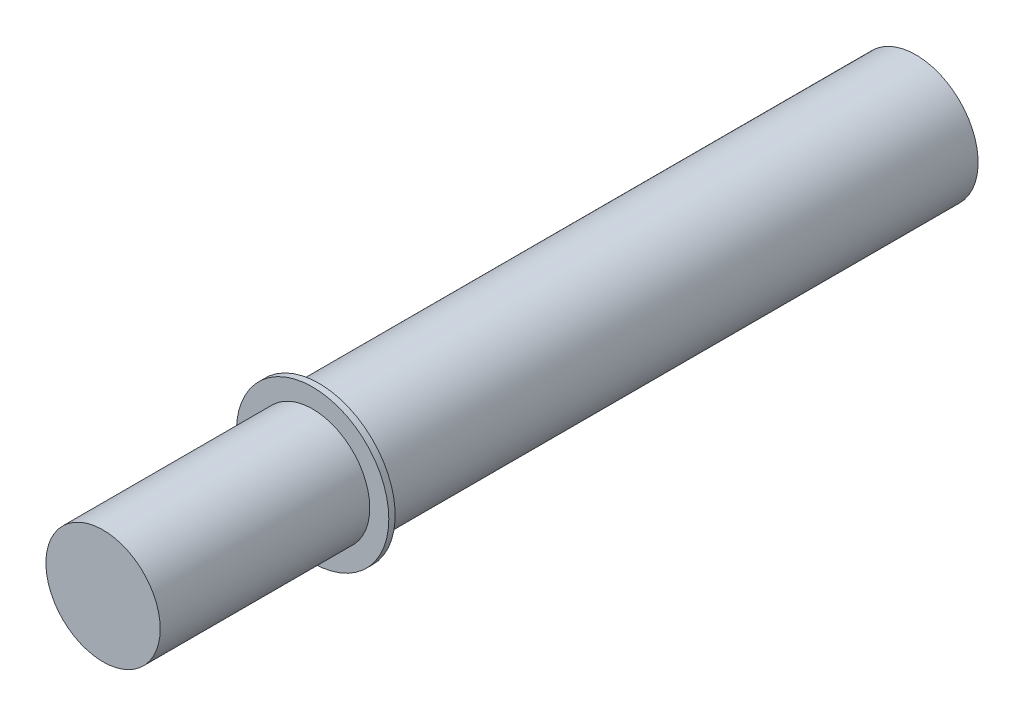
ISO-10303-21;
HEADER;
FILE_DESCRIPTION(('STEP AP214'),'2;1');
FILE_NAME('part.step','',(''),(''),'','','');
FILE_SCHEMA(('AUTOMOTIVE_DESIGN { 1 0 10303 214 1 1 1 1 }'));
ENDSEC;
DATA;
#1=APPLICATION_CONTEXT('core data for automotive mechanical design processes');
#2=APPLICATION_PROTOCOL_DEFINITION('international standard','automotive_design',2000,#1);
#3=PRODUCT_CONTEXT('',#1,'mechanical');
#4=PRODUCT('Part','Part','',(#3));
#5=PRODUCT_RELATED_PRODUCT_CATEGORY('part','',(#4));
#6=PRODUCT_DEFINITION_FORMATION('','',#4);
#7=PRODUCT_DEFINITION_CONTEXT('part definition',#1,'design');
#8=PRODUCT_DEFINITION('design','',#6,#7);
#9=PRODUCT_DEFINITION_SHAPE('','',#8);
#10=(LENGTH_UNIT() NAMED_UNIT(*) SI_UNIT(.MILLI.,.METRE.));
#11=(NAMED_UNIT(*) PLANE_ANGLE_UNIT() SI_UNIT($,.RADIAN.));
#12=(NAMED_UNIT(*) SI_UNIT($,.STERADIAN.) SOLID_ANGLE_UNIT());
#13=UNCERTAINTY_MEASURE_WITH_UNIT(LENGTH_MEASURE(1.E-05),#10,'distance_accuracy_value','');
#14=(GEOMETRIC_REPRESENTATION_CONTEXT(3) GLOBAL_UNCERTAINTY_ASSIGNED_CONTEXT((#13)) GLOBAL_UNIT_ASSIGNED_CONTEXT((#10,
#11,#12)) REPRESENTATION_CONTEXT('',''));
#15=CARTESIAN_POINT('',(0.,0.,0.));
#16=DIRECTION('',(0.,0.,1.));
#17=DIRECTION('',(1.,0.,0.));
#18=AXIS2_PLACEMENT_3D('',#15,#16,#17);
#19=CARTESIAN_POINT('',(0.,0.,64.));
#20=DIRECTION('',(0.,0.,-1.));
#21=DIRECTION('',(-1.,0.,0.));
#22=AXIS2_PLACEMENT_3D('',#19,#20,#21);
#23=CYLINDRICAL_SURFACE('',#22,6.);
#24=CARTESIAN_POINT('',(0.,0.,47.));
#25=DIRECTION('',(0.,0.,-1.));
#26=DIRECTION('',(-1.,0.,0.));
#27=AXIS2_PLACEMENT_3D('',#24,#25,#26);
#28=CIRCLE('',#27,6.);
#29=CARTESIAN_POINT('',(-6.,0.,47.));
#30=VERTEX_POINT('',#29);
#31=EDGE_CURVE('E11',#30,#30,#28,.T.);
#32=ORIENTED_EDGE('',*,*,#31,.F.);
#33=EDGE_LOOP('',(#32));
#34=FACE_BOUND('',#33,.T.);
#35=CARTESIAN_POINT('',(0.,0.,47.5));
#36=DIRECTION('',(0.,0.,1.));
#37=DIRECTION('',(1.,0.,0.));
#38=AXIS2_PLACEMENT_3D('',#35,#36,#37);
#39=CIRCLE('',#38,6.);
#40=CARTESIAN_POINT('',(6.,0.,47.5));
#41=VERTEX_POINT('',#40);
#42=EDGE_CURVE('E38',#41,#41,#39,.T.);
#43=ORIENTED_EDGE('',*,*,#42,.F.);
#44=EDGE_LOOP('',(#43));
#45=FACE_BOUND('',#44,.T.);
#46=ADVANCED_FACE('F35',(#34,#45),#23,.T.);
#47=CARTESIAN_POINT('',(0.,0.,47.));
#48=DIRECTION('',(0.,0.,-1.));
#49=DIRECTION('',(-1.,0.,0.));
#50=AXIS2_PLACEMENT_3D('',#47,#48,#49);
#51=PLANE('',#50);
#52=CARTESIAN_POINT('',(0.,0.,47.));
#53=DIRECTION('',(0.,0.,-1.));
#54=DIRECTION('',(-1.,0.,0.));
#55=AXIS2_PLACEMENT_3D('',#52,#53,#54);
#56=CIRCLE('',#55,4.9);
#57=CARTESIAN_POINT('',(-4.9,0.,47.));
#58=VERTEX_POINT('',#57);
#59=EDGE_CURVE('E42',#58,#58,#56,.T.);
#60=ORIENTED_EDGE('',*,*,#59,.F.);
#61=EDGE_LOOP('',(#60));
#62=FACE_BOUND('',#61,.T.);
#63=ORIENTED_EDGE('',*,*,#31,.T.);
#64=EDGE_LOOP('',(#63));
#65=FACE_BOUND('',#64,.T.);
#66=ADVANCED_FACE('F64',(#62,#65),#51,.T.);
#67=CARTESIAN_POINT('',(0.,0.,47.));
#68=DIRECTION('',(0.,0.,-1.));
#69=DIRECTION('',(-1.,0.,0.));
#70=AXIS2_PLACEMENT_3D('',#67,#68,#69);
#71=CYLINDRICAL_SURFACE('',#70,4.9);
#72=ORIENTED_EDGE('',*,*,#59,.T.);
#73=EDGE_LOOP('',(#72));
#74=FACE_BOUND('',#73,.T.);
#75=CARTESIAN_POINT('',(0.,0.,0.));
#76=DIRECTION('',(0.,0.,-1.));
#77=DIRECTION('',(-1.,0.,0.));
#78=AXIS2_PLACEMENT_3D('',#75,#76,#77);
#79=CIRCLE('',#78,4.9);
#80=CARTESIAN_POINT('',(-4.9,0.,0.));
#81=VERTEX_POINT('',#80);
#82=EDGE_CURVE('E46',#81,#81,#79,.T.);
#83=ORIENTED_EDGE('',*,*,#82,.F.);
#84=EDGE_LOOP('',(#83));
#85=FACE_BOUND('',#84,.T.);
#86=ADVANCED_FACE('F69',(#74,#85),#71,.T.);
#87=CARTESIAN_POINT('',(0.,0.,0.));
#88=DIRECTION('',(0.,0.,1.));
#89=DIRECTION('',(1.,0.,0.));
#90=AXIS2_PLACEMENT_3D('',#87,#88,#89);
#91=PLANE('',#90);
#92=ORIENTED_EDGE('',*,*,#82,.T.);
#93=EDGE_LOOP('',(#92));
#94=FACE_BOUND('',#93,.T.);
#95=ADVANCED_FACE('F75',(#94),#91,.F.);
#96=CARTESIAN_POINT('',(0.,0.,47.5));
#97=DIRECTION('',(0.,0.,1.));
#98=DIRECTION('',(1.,0.,0.));
#99=AXIS2_PLACEMENT_3D('',#96,#97,#98);
#100=PLANE('',#99);
#101=CARTESIAN_POINT('',(0.,0.,47.5));
#102=DIRECTION('',(0.,0.,1.));
#103=DIRECTION('',(1.,0.,0.));
#104=AXIS2_PLACEMENT_3D('',#101,#102,#103);
#105=CIRCLE('',#104,4.5);
#106=CARTESIAN_POINT('',(4.5,0.,47.5));
#107=VERTEX_POINT('',#106);
#108=EDGE_CURVE('E54',#107,#107,#105,.T.);
#109=ORIENTED_EDGE('',*,*,#108,.F.);
#110=EDGE_LOOP('',(#109));
#111=FACE_BOUND('',#110,.T.);
#112=ORIENTED_EDGE('',*,*,#42,.T.);
#113=EDGE_LOOP('',(#112));
#114=FACE_BOUND('',#113,.T.);
#115=ADVANCED_FACE('F61',(#111,#114),#100,.T.);
#116=CARTESIAN_POINT('',(0.,0.,47.5));
#117=DIRECTION('',(0.,0.,1.));
#118=DIRECTION('',(1.,0.,0.));
#119=AXIS2_PLACEMENT_3D('',#116,#117,#118);
#120=CYLINDRICAL_SURFACE('',#119,4.5);
#121=ORIENTED_EDGE('',*,*,#108,.T.);
#122=EDGE_LOOP('',(#121));
#123=FACE_BOUND('',#122,.T.);
#124=CARTESIAN_POINT('',(0.,0.,64.));
#125=DIRECTION('',(0.,0.,1.));
#126=DIRECTION('',(1.,0.,0.));
#127=AXIS2_PLACEMENT_3D('',#124,#125,#126);
#128=CIRCLE('',#127,4.5);
#129=CARTESIAN_POINT('',(4.5,0.,64.));
#130=VERTEX_POINT('',#129);
#131=EDGE_CURVE('E51',#130,#130,#128,.T.);
#132=ORIENTED_EDGE('',*,*,#131,.F.);
#133=EDGE_LOOP('',(#132));
#134=FACE_BOUND('',#133,.T.);
#135=ADVANCED_FACE('F83',(#123,#134),#120,.T.);
#136=CARTESIAN_POINT('',(0.,0.,64.));
#137=DIRECTION('',(0.,0.,1.));
#138=DIRECTION('',(1.,0.,0.));
#139=AXIS2_PLACEMENT_3D('',#136,#137,#138);
#140=PLANE('',#139);
#141=ORIENTED_EDGE('',*,*,#131,.T.);
#142=EDGE_LOOP('',(#141));
#143=FACE_BOUND('',#142,.T.);
#144=ADVANCED_FACE('F81',(#143),#140,.T.);
#145=CLOSED_SHELL('',(#46,#66,#86,#95,#115,#135,#144));
#146=MANIFOLD_SOLID_BREP('B2',#145);
#147=ADVANCED_BREP_SHAPE_REPRESENTATION('',(#18,#146),#14);
#148=SHAPE_DEFINITION_REPRESENTATION(#9,#147);
ENDSEC;
END-ISO-10303-21;
